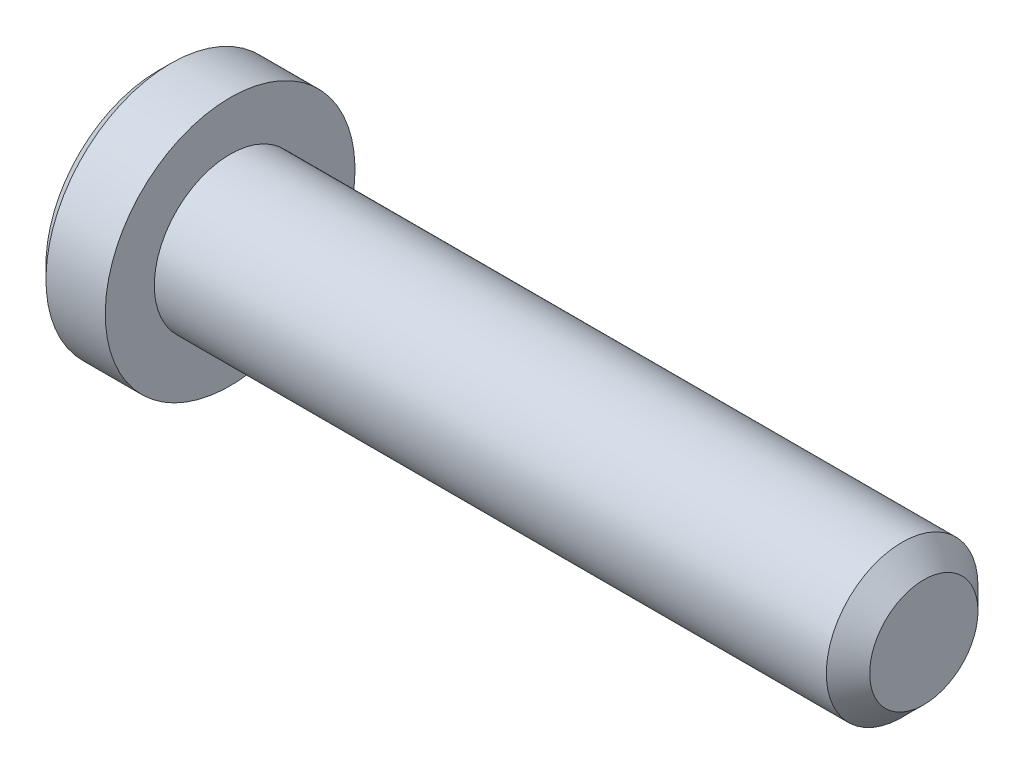
ISO-10303-21;
HEADER;
FILE_DESCRIPTION(('STEP AP214'),'2;1');
FILE_NAME('part.step','',(''),(''),'','','');
FILE_SCHEMA(('AUTOMOTIVE_DESIGN { 1 0 10303 214 1 1 1 1 }'));
ENDSEC;
DATA;
#1=APPLICATION_CONTEXT('core data for automotive mechanical design processes');
#2=APPLICATION_PROTOCOL_DEFINITION('international standard','automotive_design',2000,#1);
#3=PRODUCT_CONTEXT('',#1,'mechanical');
#4=PRODUCT('Part','Part','',(#3));
#5=PRODUCT_RELATED_PRODUCT_CATEGORY('part','',(#4));
#6=PRODUCT_DEFINITION_FORMATION('','',#4);
#7=PRODUCT_DEFINITION_CONTEXT('part definition',#1,'design');
#8=PRODUCT_DEFINITION('design','',#6,#7);
#9=PRODUCT_DEFINITION_SHAPE('','',#8);
#10=(LENGTH_UNIT() NAMED_UNIT(*) SI_UNIT(.MILLI.,.METRE.));
#11=(NAMED_UNIT(*) PLANE_ANGLE_UNIT() SI_UNIT($,.RADIAN.));
#12=(NAMED_UNIT(*) SI_UNIT($,.STERADIAN.) SOLID_ANGLE_UNIT());
#13=UNCERTAINTY_MEASURE_WITH_UNIT(LENGTH_MEASURE(1.E-05),#10,'distance_accuracy_value','');
#14=(GEOMETRIC_REPRESENTATION_CONTEXT(3) GLOBAL_UNCERTAINTY_ASSIGNED_CONTEXT((#13)) GLOBAL_UNIT_ASSIGNED_CONTEXT((#10,
#11,#12)) REPRESENTATION_CONTEXT('',''));
#15=CARTESIAN_POINT('',(0.,0.,0.));
#16=DIRECTION('',(0.,0.,1.));
#17=DIRECTION('',(1.,0.,0.));
#18=AXIS2_PLACEMENT_3D('',#15,#16,#17);
#19=CARTESIAN_POINT('',(-11.509375,3.0734,0.));
#20=DIRECTION('',(-1.,0.,0.));
#21=DIRECTION('',(0.,-1.,0.));
#22=AXIS2_PLACEMENT_3D('',#19,#20,#21);
#23=PLANE('',#22);
#24=CARTESIAN_POINT('',(-11.509375,0.,0.));
#25=DIRECTION('',(-1.,0.,0.));
#26=DIRECTION('',(0.,-1.,0.));
#27=AXIS2_PLACEMENT_3D('',#24,#25,#26);
#28=CIRCLE('',#27,1.14567944042314);
#29=CARTESIAN_POINT('',(-11.509375,-1.14567944042313,0.));
#30=VERTEX_POINT('',#29);
#31=CARTESIAN_POINT('',(-11.509375,-0.572839720211614,0.992187499999946));
#32=VERTEX_POINT('',#31);
#33=EDGE_CURVE('E142',#30,#32,#28,.T.);
#34=ORIENTED_EDGE('',*,*,#33,.F.);
#35=CARTESIAN_POINT('',(-11.509375,-0.572839720211583,-0.9921875));
#36=VERTEX_POINT('',#35);
#37=EDGE_CURVE('E139',#36,#30,#28,.T.);
#38=ORIENTED_EDGE('',*,*,#37,.F.);
#39=CARTESIAN_POINT('',(-11.509375,0.572839720211541,-0.992187499999999));
#40=VERTEX_POINT('',#39);
#41=EDGE_CURVE('E107',#40,#36,#28,.T.);
#42=ORIENTED_EDGE('',*,*,#41,.F.);
#43=CARTESIAN_POINT('',(-11.509375,1.14567944042315,0.));
#44=VERTEX_POINT('',#43);
#45=EDGE_CURVE('E99',#44,#40,#28,.T.);
#46=ORIENTED_EDGE('',*,*,#45,.F.);
#47=CARTESIAN_POINT('',(-11.509375,0.572839720211539,0.9921875));
#48=VERTEX_POINT('',#47);
#49=EDGE_CURVE('E60',#48,#44,#28,.T.);
#50=ORIENTED_EDGE('',*,*,#49,.F.);
#51=EDGE_CURVE('E67',#32,#48,#28,.T.);
#52=ORIENTED_EDGE('',*,*,#51,.F.);
#53=EDGE_LOOP('',(#34,#38,#42,#46,#50,#52));
#54=FACE_BOUND('',#53,.T.);
#55=CARTESIAN_POINT('',(-11.509375,0.,0.));
#56=DIRECTION('',(1.,0.,0.));
#57=DIRECTION('',(0.,1.,0.));
#58=AXIS2_PLACEMENT_3D('',#55,#56,#57);
#59=CIRCLE('',#58,3.0734);
#60=CARTESIAN_POINT('',(-11.509375,3.0734,0.));
#61=VERTEX_POINT('',#60);
#62=EDGE_CURVE('E237',#61,#61,#59,.T.);
#63=ORIENTED_EDGE('',*,*,#62,.F.);
#64=EDGE_LOOP('',(#63));
#65=FACE_BOUND('',#64,.T.);
#66=ADVANCED_FACE('F39',(#54,#65),#23,.T.);
#67=CARTESIAN_POINT('',(-9.525,0.,0.));
#68=DIRECTION('',(1.,0.,0.));
#69=DIRECTION('',(0.,0.,-1.));
#70=AXIS2_PLACEMENT_3D('',#67,#68,#69);
#71=CYLINDRICAL_SURFACE('',#70,2.0828);
#72=CARTESIAN_POINT('',(8.9296875,0.,0.));
#73=DIRECTION('',(1.,0.,0.));
#74=DIRECTION('',(0.,0.,-1.));
#75=AXIS2_PLACEMENT_3D('',#72,#73,#74);
#76=CIRCLE('',#75,2.0828);
#77=CARTESIAN_POINT('',(8.9296875,0.,-2.0828));
#78=VERTEX_POINT('',#77);
#79=EDGE_CURVE('E54',#78,#78,#76,.F.);
#80=CARTESIAN_POINT('',(-9.525,0.,0.));
#81=DIRECTION('',(1.,0.,0.));
#82=DIRECTION('',(0.,1.,0.));
#83=AXIS2_PLACEMENT_3D('',#80,#81,#82);
#84=CIRCLE('',#83,2.0828);
#85=CARTESIAN_POINT('',(-9.525,0.,-2.0828));
#86=VERTEX_POINT('',#85);
#87=EDGE_CURVE('E227',#86,#86,#84,.F.);
#88=CARTESIAN_POINT('',(8.9296875,0.,-2.0828));
#89=CARTESIAN_POINT('',(8.737451171875,0.,-2.0828));
#90=CARTESIAN_POINT('',(8.54521484375,0.,-2.0828));
#91=CARTESIAN_POINT('',(8.1607421875,0.,-2.0828));
#92=CARTESIAN_POINT('',(7.968505859375,0.,-2.0828));
#93=CARTESIAN_POINT('',(7.584033203125,0.,-2.0828));
#94=CARTESIAN_POINT('',(7.391796875,0.,-2.0828));
#95=CARTESIAN_POINT('',(7.00732421875,0.,-2.0828));
#96=CARTESIAN_POINT('',(6.815087890625,0.,-2.0828));
#97=CARTESIAN_POINT('',(6.430615234375,0.,-2.0828));
#98=CARTESIAN_POINT('',(6.23837890625,0.,-2.0828));
#99=CARTESIAN_POINT('',(5.85390625,0.,-2.0828));
#100=CARTESIAN_POINT('',(5.661669921875,0.,-2.0828));
#101=CARTESIAN_POINT('',(5.277197265625,0.,-2.0828));
#102=CARTESIAN_POINT('',(5.0849609375,0.,-2.0828));
#103=CARTESIAN_POINT('',(4.70048828125,0.,-2.0828));
#104=CARTESIAN_POINT('',(4.508251953125,0.,-2.0828));
#105=CARTESIAN_POINT('',(4.123779296875,0.,-2.0828));
#106=CARTESIAN_POINT('',(3.93154296875,0.,-2.0828));
#107=CARTESIAN_POINT('',(3.5470703125,0.,-2.0828));
#108=CARTESIAN_POINT('',(3.354833984375,0.,-2.0828));
#109=CARTESIAN_POINT('',(2.970361328125,0.,-2.0828));
#110=CARTESIAN_POINT('',(2.778125,0.,-2.0828));
#111=CARTESIAN_POINT('',(2.39365234375,0.,-2.0828));
#112=CARTESIAN_POINT('',(2.201416015625,0.,-2.0828));
#113=CARTESIAN_POINT('',(1.816943359375,0.,-2.0828));
#114=CARTESIAN_POINT('',(1.62470703125,0.,-2.0828));
#115=CARTESIAN_POINT('',(1.240234375,0.,-2.0828));
#116=CARTESIAN_POINT('',(1.047998046875,0.,-2.0828));
#117=CARTESIAN_POINT('',(0.663525390625,0.,-2.0828));
#118=CARTESIAN_POINT('',(0.4712890625,0.,-2.0828));
#119=CARTESIAN_POINT('',(0.0868164062500001,0.,-2.0828));
#120=CARTESIAN_POINT('',(-0.105419921875,0.,-2.0828));
#121=CARTESIAN_POINT('',(-0.489892578125,0.,-2.0828));
#122=CARTESIAN_POINT('',(-0.68212890625,0.,-2.0828));
#123=CARTESIAN_POINT('',(-1.0666015625,0.,-2.0828));
#124=CARTESIAN_POINT('',(-1.258837890625,0.,-2.0828));
#125=CARTESIAN_POINT('',(-1.643310546875,0.,-2.0828));
#126=CARTESIAN_POINT('',(-1.835546875,0.,-2.0828));
#127=CARTESIAN_POINT('',(-2.22001953125,0.,-2.0828));
#128=CARTESIAN_POINT('',(-2.412255859375,0.,-2.0828));
#129=CARTESIAN_POINT('',(-2.796728515625,0.,-2.0828));
#130=CARTESIAN_POINT('',(-2.98896484375,0.,-2.0828));
#131=CARTESIAN_POINT('',(-3.3734375,0.,-2.0828));
#132=CARTESIAN_POINT('',(-3.565673828125,0.,-2.0828));
#133=CARTESIAN_POINT('',(-3.950146484375,0.,-2.0828));
#134=CARTESIAN_POINT('',(-4.1423828125,0.,-2.0828));
#135=CARTESIAN_POINT('',(-4.52685546875,0.,-2.0828));
#136=CARTESIAN_POINT('',(-4.719091796875,0.,-2.0828));
#137=CARTESIAN_POINT('',(-5.103564453125,0.,-2.0828));
#138=CARTESIAN_POINT('',(-5.29580078125,0.,-2.0828));
#139=CARTESIAN_POINT('',(-5.6802734375,0.,-2.0828));
#140=CARTESIAN_POINT('',(-5.872509765625,0.,-2.0828));
#141=CARTESIAN_POINT('',(-6.256982421875,0.,-2.0828));
#142=CARTESIAN_POINT('',(-6.44921875,0.,-2.0828));
#143=CARTESIAN_POINT('',(-6.83369140625,0.,-2.0828));
#144=CARTESIAN_POINT('',(-7.025927734375,0.,-2.0828));
#145=CARTESIAN_POINT('',(-7.410400390625,0.,-2.0828));
#146=CARTESIAN_POINT('',(-7.60263671875,0.,-2.0828));
#147=CARTESIAN_POINT('',(-7.987109375,0.,-2.0828));
#148=CARTESIAN_POINT('',(-8.179345703125,0.,-2.0828));
#149=CARTESIAN_POINT('',(-8.563818359375,0.,-2.0828));
#150=CARTESIAN_POINT('',(-8.7560546875,0.,-2.0828));
#151=CARTESIAN_POINT('',(-9.14052734375,0.,-2.0828));
#152=CARTESIAN_POINT('',(-9.332763671875,0.,-2.0828));
#153=CARTESIAN_POINT('',(-9.525,0.,-2.0828));
#154=B_SPLINE_CURVE_WITH_KNOTS('',3,(#88,#89,#90,#91,#92,#93,#94,#95,#96,#97,#98,#99,#100,#101,
#102,#103,#104,#105,#106,#107,#108,#109,#110,#111,#112,#113,#114,#115,#116,#117,#118,#119,#120,
#121,#122,#123,#124,#125,#126,#127,#128,#129,#130,#131,#132,#133,#134,#135,#136,#137,#138,#139,
#140,#141,#142,#143,#144,#145,#146,#147,#148,#149,#150,#151,#152,#153),.UNSPECIFIED.,.F.,.F.,(4,
2,2,2,2,2,2,2,2,2,2,2,2,2,2,2,2,2,2,2,2,2,2,2,2,2,2,2,2,2,2,2,4),(0.,0.576708984375,
1.15341796875,1.730126953125,2.3068359375,2.883544921875,3.46025390625,4.036962890625,
4.613671875,5.190380859375,5.76708984375,6.343798828125,6.9205078125,7.497216796875,
8.07392578125,8.650634765625,9.22734375,9.804052734375,10.38076171875,10.957470703125,
11.5341796875,12.110888671875,12.68759765625,13.264306640625,13.841015625,14.417724609375,
14.99443359375,15.571142578125,16.1478515625,16.724560546875,17.30126953125,17.877978515625,
18.4546875),.UNSPECIFIED.);
#155=EDGE_CURVE('BSEAM207',#78,#86,#154,.T.);
#156=ORIENTED_EDGE('',*,*,#79,.T.);
#157=ORIENTED_EDGE('',*,*,#87,.F.);
#158=ORIENTED_EDGE('',*,*,#155,.T.);
#159=ORIENTED_EDGE('',*,*,#155,.F.);
#160=EDGE_LOOP('',(#156,#158,#157,#159));
#161=FACE_BOUND('',#160,.T.);
#162=ADVANCED_FACE('F207',(#161),#71,.T.);
#163=CARTESIAN_POINT('',(9.525,0.,0.));
#164=DIRECTION('',(1.,0.,0.));
#165=DIRECTION('',(0.,0.,-1.));
#166=AXIS2_PLACEMENT_3D('',#163,#164,#165);
#167=PLANE('',#166);
#168=CARTESIAN_POINT('',(9.525,0.,0.));
#169=DIRECTION('',(1.,0.,0.));
#170=DIRECTION('',(0.,0.,-1.));
#171=AXIS2_PLACEMENT_3D('',#168,#169,#170);
#172=CIRCLE('',#171,1.48748749999999);
#173=CARTESIAN_POINT('',(9.525,0.,-1.48748749999999));
#174=VERTEX_POINT('',#173);
#175=EDGE_CURVE('E229',#174,#174,#172,.T.);
#176=ORIENTED_EDGE('',*,*,#175,.T.);
#177=EDGE_LOOP('',(#176));
#178=FACE_BOUND('',#177,.T.);
#179=ADVANCED_FACE('F215',(#178),#167,.T.);
#180=CARTESIAN_POINT('',(9.525,0.,0.));
#181=DIRECTION('',(-1.,0.,0.));
#182=DIRECTION('',(0.,0.,1.));
#183=AXIS2_PLACEMENT_3D('',#180,#181,#182);
#184=CONICAL_SURFACE('',#183,1.48748749999999,0.785398163397454);
#185=ORIENTED_EDGE('',*,*,#79,.F.);
#186=EDGE_LOOP('',(#185));
#187=FACE_BOUND('',#186,.T.);
#188=ORIENTED_EDGE('',*,*,#175,.F.);
#189=EDGE_LOOP('',(#188));
#190=FACE_BOUND('',#189,.T.);
#191=ADVANCED_FACE('F41',(#187,#190),#184,.T.);
#192=CARTESIAN_POINT('',(-9.525,0.,0.));
#193=DIRECTION('',(1.,0.,0.));
#194=DIRECTION('',(0.,1.,0.));
#195=AXIS2_PLACEMENT_3D('',#192,#193,#194);
#196=CYLINDRICAL_SURFACE('',#195,3.429);
#197=CARTESIAN_POINT('',(-11.153775,0.,0.));
#198=DIRECTION('',(1.,0.,0.));
#199=DIRECTION('',(0.,1.,0.));
#200=AXIS2_PLACEMENT_3D('',#197,#198,#199);
#201=CIRCLE('',#200,3.429);
#202=CARTESIAN_POINT('',(-11.153775,3.429,0.));
#203=VERTEX_POINT('',#202);
#204=EDGE_CURVE('E230',#203,#203,#201,.T.);
#205=ORIENTED_EDGE('',*,*,#204,.T.);
#206=EDGE_LOOP('',(#205));
#207=FACE_BOUND('',#206,.T.);
#208=CARTESIAN_POINT('',(-9.525,0.,0.));
#209=DIRECTION('',(1.,0.,0.));
#210=DIRECTION('',(0.,1.,0.));
#211=AXIS2_PLACEMENT_3D('',#208,#209,#210);
#212=CIRCLE('',#211,3.429);
#213=CARTESIAN_POINT('',(-9.525,3.429,0.));
#214=VERTEX_POINT('',#213);
#215=EDGE_CURVE('E244',#214,#214,#212,.T.);
#216=ORIENTED_EDGE('',*,*,#215,.F.);
#217=EDGE_LOOP('',(#216));
#218=FACE_BOUND('',#217,.T.);
#219=ADVANCED_FACE('F210',(#207,#218),#196,.T.);
#220=CARTESIAN_POINT('',(-11.153775,0.,0.));
#221=DIRECTION('',(1.,0.,0.));
#222=DIRECTION('',(0.,1.,0.));
#223=AXIS2_PLACEMENT_3D('',#220,#221,#222);
#224=CONICAL_SURFACE('',#223,3.429,0.785398163397454);
#225=ORIENTED_EDGE('',*,*,#62,.T.);
#226=EDGE_LOOP('',(#225));
#227=FACE_BOUND('',#226,.T.);
#228=ORIENTED_EDGE('',*,*,#204,.F.);
#229=EDGE_LOOP('',(#228));
#230=FACE_BOUND('',#229,.T.);
#231=ADVANCED_FACE('F203',(#227,#230),#224,.T.);
#232=CARTESIAN_POINT('',(-9.525,3.429,0.));
#233=DIRECTION('',(1.,0.,0.));
#234=DIRECTION('',(0.,1.,0.));
#235=AXIS2_PLACEMENT_3D('',#232,#233,#234);
#236=PLANE('',#235);
#237=ORIENTED_EDGE('',*,*,#87,.T.);
#238=EDGE_LOOP('',(#237));
#239=FACE_BOUND('',#238,.T.);
#240=ORIENTED_EDGE('',*,*,#215,.T.);
#241=EDGE_LOOP('',(#240));
#242=FACE_BOUND('',#241,.T.);
#243=ADVANCED_FACE('F166',(#239,#242),#236,.T.);
#244=CARTESIAN_POINT('',(-11.509375,0.,0.));
#245=DIRECTION('',(-1.,0.,0.));
#246=DIRECTION('',(0.,-1.,0.));
#247=AXIS2_PLACEMENT_3D('',#244,#245,#246);
#248=CONICAL_SURFACE('',#247,1.14567944042314,0.78539816339745);
#249=CARTESIAN_POINT('',(-11.8768670395338,-1.14247621095532,-0.9921875));
#250=CARTESIAN_POINT('',(-11.8558666393704,-1.11465764817296,-0.9921875));
#251=CARTESIAN_POINT('',(-11.8350721478217,-1.08668408109738,-0.9921875));
#252=CARTESIAN_POINT('',(-11.7939800377932,-1.03036405380651,-0.9921875));
#253=CARTESIAN_POINT('',(-11.7736825444585,-1.00201750238007,-0.9921875));
#254=CARTESIAN_POINT('',(-11.7133735075809,-0.915909012474774,-0.9921875));
#255=CARTESIAN_POINT('',(-11.67426885225,-0.857501195957509,-0.9921875));
#256=CARTESIAN_POINT('',(-11.5975017528187,-0.735022281337396,-0.9921875));
#257=CARTESIAN_POINT('',(-11.5600490310437,-0.670818221979862,-0.9921875));
#258=CARTESIAN_POINT('',(-11.4915400204898,-0.539203244273786,-0.9921875));
#259=CARTESIAN_POINT('',(-11.4604621682744,-0.471804119013388,-0.9921875));
#260=CARTESIAN_POINT('',(-11.42244129625,-0.370637445291602,-0.9921875));
#261=CARTESIAN_POINT('',(-11.4115290323464,-0.338367677294395,-0.9921875));
#262=CARTESIAN_POINT('',(-11.392295230113,-0.273049086298095,-0.9921875));
#263=CARTESIAN_POINT('',(-11.3839738702603,-0.240000209797903,-0.992187499999999));
#264=CARTESIAN_POINT('',(-11.3704937736932,-0.173878395879211,-0.992187499999999));
#265=CARTESIAN_POINT('',(-11.3652803939747,-0.140816774783566,-0.992187499999999));
#266=CARTESIAN_POINT('',(-11.3581147124628,-0.0743291672741376,-0.992187499999999));
#267=CARTESIAN_POINT('',(-11.3561629080388,-0.0409031260707294,-0.992187499999999));
#268=CARTESIAN_POINT('',(-11.3556684859037,0.0247631140270538,-0.992187499999999));
#269=CARTESIAN_POINT('',(-11.3570050314158,0.0570024444112343,-0.992187499999999));
#270=CARTESIAN_POINT('',(-11.3627460432024,0.121194220405742,-0.992187499999999));
#271=CARTESIAN_POINT('',(-11.367149804079,0.153146730268,-0.992187499999999));
#272=CARTESIAN_POINT('',(-11.3788595111375,0.21709052455368,-0.992187499999999));
#273=CARTESIAN_POINT('',(-11.3862153024107,0.249072542042758,-0.992187499999999));
#274=CARTESIAN_POINT('',(-11.4034380913517,0.312337779646064,-0.992187499999999));
#275=CARTESIAN_POINT('',(-11.4133048788974,0.343621057993199,-0.992187499999999));
#276=CARTESIAN_POINT('',(-11.4480811115409,0.442112982998633,-0.992187499999999));
#277=CARTESIAN_POINT('',(-11.476951164078,0.507919771037756,-0.992187499999999));
#278=CARTESIAN_POINT('',(-11.5411402098148,0.636441890981761,-0.992187499999999));
#279=CARTESIAN_POINT('',(-11.5764823720824,0.699145053739854,-0.992187499999999));
#280=CARTESIAN_POINT('',(-11.6493963707045,0.818979829838894,-0.992187499999999));
#281=CARTESIAN_POINT('',(-11.6867701348683,0.87623347144014,-0.992187499999999));
#282=CARTESIAN_POINT('',(-11.744546111699,0.960585190489413,-0.992187499999999));
#283=CARTESIAN_POINT('',(-11.764008487457,0.988338378120962,-0.992187499999999));
#284=CARTESIAN_POINT('',(-11.803447981541,1.04346551309541,-0.992187499999999));
#285=CARTESIAN_POINT('',(-11.8234249576456,1.07083956207301,-0.992187499999999));
#286=CARTESIAN_POINT('',(-11.8436153053952,1.09805574489948,-0.992187499999999));
#287=B_SPLINE_CURVE_WITH_KNOTS('',3,(#249,#250,#251,#252,#253,#254,#255,#256,#257,#258,#259,
#260,#261,#262,#263,#264,#265,#266,#267,#268,#269,#270,#271,#272,#273,#274,#275,#276,#277,#278,
#279,#280,#281,#282,#283,#284,#285,#286),.UNSPECIFIED.,.F.,.F.,(4,2,2,2,2,2,2,2,2,2,2,2,2,2,2,2,
2,2,4),(0.,0.104563127391605,0.20915231871892,0.419927099055484,0.642732653996011,
0.864771652302185,0.966879847198756,1.06899507437088,1.1692575299655,1.2695352735478,
1.36618351698525,1.4628095406014,1.56114078104352,1.65946379575192,1.87441437169281,
2.090150036015,2.29516517561956,2.39685303361285,2.4985130831926),.UNSPECIFIED.);
#288=EDGE_CURVE('E11',#36,#40,#287,.T.);
#289=ORIENTED_EDGE('',*,*,#288,.T.);
#290=ORIENTED_EDGE('',*,*,#41,.T.);
#291=EDGE_LOOP('',(#289,#290));
#292=FACE_BOUND('',#291,.T.);
#293=ADVANCED_FACE('F112',(#292),#248,.F.);
#294=CARTESIAN_POINT('',(-11.509490487509,-1.145794910477,0.000199999999999935));
#295=CARTESIAN_POINT('',(-11.4898078114047,-1.12609913995856,-0.0339140752321566));
#296=CARTESIAN_POINT('',(-11.4712806845185,-1.10607402631377,-0.0685985894922806));
#297=CARTESIAN_POINT('',(-11.4373573296504,-1.06524035596263,-0.139324581199961));
#298=CARTESIAN_POINT('',(-11.421979987231,-1.04442791197037,-0.175372791624244));
#299=CARTESIAN_POINT('',(-11.3956381427343,-1.00246048249572,-0.248062511737398));
#300=CARTESIAN_POINT('',(-11.3846073965132,-0.98131619670701,-0.284685489013204));
#301=CARTESIAN_POINT('',(-11.367611205673,-0.938562244623586,-0.35873750624606));
#302=CARTESIAN_POINT('',(-11.361633067579,-0.916953885244211,-0.396164282559346));
#303=CARTESIAN_POINT('',(-11.3562413449143,-0.879714587318151,-0.460664638605475));
#304=CARTESIAN_POINT('',(-11.3554439963884,-0.86413209944244,-0.487654299314533));
#305=CARTESIAN_POINT('',(-11.3567831933615,-0.83299729877985,-0.541581355945668));
#306=CARTESIAN_POINT('',(-11.3589203861371,-0.81744499340817,-0.568518739024244));
#307=CARTESIAN_POINT('',(-11.3695925713061,-0.771010163908482,-0.648946222958502));
#308=CARTESIAN_POINT('',(-11.3823893807227,-0.740358726795443,-0.702036069363288));
#309=CARTESIAN_POINT('',(-11.4132724676502,-0.686562055130078,-0.795214637965801));
#310=CARTESIAN_POINT('',(-11.4297400089077,-0.663164549602743,-0.835740306309519));
#311=CARTESIAN_POINT('',(-11.4668353835568,-0.617285982385523,-0.915204315708208));
#312=CARTESIAN_POINT('',(-11.4874496806456,-0.594802217831309,-0.954147338261523));
#313=CARTESIAN_POINT('',(-11.509490487509,-0.572724250157745,-0.992387499999999));
#314=B_SPLINE_CURVE_WITH_KNOTS('',3,(#294,#295,#296,#297,#298,#299,#300,#301,#302,#303,#304,
#305,#306,#307,#308,#309,#310,#311,#312,#313),.UNSPECIFIED.,.F.,.F.,(4,2,2,2,2,2,2,2,2,4),(0.,
0.132197185210191,0.265165186853265,0.396020097605673,0.526545281028579,0.619935205043269,
0.71334573153617,0.900220051846375,1.04884529769095,1.19699303557669),.UNSPECIFIED.);
#315=EDGE_CURVE('E145',#30,#36,#314,.T.);
#316=ORIENTED_EDGE('',*,*,#315,.T.);
#317=ORIENTED_EDGE('',*,*,#37,.T.);
#318=EDGE_LOOP('',(#316,#317));
#319=FACE_BOUND('',#318,.T.);
#320=ADVANCED_FACE('F165',(#319),#248,.F.);
#321=CARTESIAN_POINT('',(-11.509490487509,-0.572724250157744,0.9923875));
#322=CARTESIAN_POINT('',(-11.4898078114047,-0.592420020676184,0.958273424767845));
#323=CARTESIAN_POINT('',(-11.4712806845184,-0.612445134320978,0.923588910507721));
#324=CARTESIAN_POINT('',(-11.4373573296504,-0.65327880467211,0.852862918800042));
#325=CARTESIAN_POINT('',(-11.421979987231,-0.674091248664374,0.816814708375759));
#326=CARTESIAN_POINT('',(-11.3956381427343,-0.716058678139021,0.744124988262607));
#327=CARTESIAN_POINT('',(-11.3846073965132,-0.737202963927733,0.707502010986801));
#328=CARTESIAN_POINT('',(-11.367611205673,-0.779956916011156,0.633449993753947));
#329=CARTESIAN_POINT('',(-11.361633067579,-0.801565275390531,0.596023217440661));
#330=CARTESIAN_POINT('',(-11.3562413449143,-0.83880457331659,0.531522861394533));
#331=CARTESIAN_POINT('',(-11.3554439963884,-0.854387061192302,0.504533200685474));
#332=CARTESIAN_POINT('',(-11.3567831933615,-0.885521861854892,0.450606144054339));
#333=CARTESIAN_POINT('',(-11.3589203861371,-0.901074167226571,0.423668760975764));
#334=CARTESIAN_POINT('',(-11.3695925713061,-0.94750899672626,0.343241277041506));
#335=CARTESIAN_POINT('',(-11.3823893807228,-0.978160433839299,0.29015143063672));
#336=CARTESIAN_POINT('',(-11.4132724676502,-1.03195710550467,0.196972862034205));
#337=CARTESIAN_POINT('',(-11.4297400089077,-1.055354611032,0.156447193690485));
#338=CARTESIAN_POINT('',(-11.4668353835568,-1.10123317824922,0.0769831842917937));
#339=CARTESIAN_POINT('',(-11.4874496806456,-1.12371694280344,0.0380401617384772));
#340=CARTESIAN_POINT('',(-11.509490487509,-1.145794910477,-0.000199999999999281));
#341=B_SPLINE_CURVE_WITH_KNOTS('',3,(#321,#322,#323,#324,#325,#326,#327,#328,#329,#330,#331,
#332,#333,#334,#335,#336,#337,#338,#339,#340),.UNSPECIFIED.,.F.,.F.,(4,2,2,2,2,2,2,2,2,4),(0.,
0.13219718521019,0.26516518685326,0.396020097605666,0.526545281028569,0.61993520504326,
0.71334573153616,0.900220051846366,1.04884529769095,1.19699303557669),.UNSPECIFIED.);
#342=EDGE_CURVE('E153',#32,#30,#341,.T.);
#343=ORIENTED_EDGE('',*,*,#342,.T.);
#344=ORIENTED_EDGE('',*,*,#33,.T.);
#345=EDGE_LOOP('',(#343,#344));
#346=FACE_BOUND('',#345,.T.);
#347=ADVANCED_FACE('F291',(#346),#248,.F.);
#348=CARTESIAN_POINT('',(-11.8768670394083,-1.1424762107891,0.9921875));
#349=CARTESIAN_POINT('',(-11.8558666392497,-1.1146576480114,0.9921875));
#350=CARTESIAN_POINT('',(-11.8350721477058,-1.0866840809405,0.9921875));
#351=CARTESIAN_POINT('',(-11.7939800376869,-1.03036405365903,0.9921875));
#352=CARTESIAN_POINT('',(-11.7736825443571,-1.00201750223731,0.9921875));
#353=CARTESIAN_POINT('',(-11.713373507494,-0.915909012346482,0.9921875));
#354=CARTESIAN_POINT('',(-11.6742688521727,-0.857501195839053,0.9921875));
#355=CARTESIAN_POINT('',(-11.5975017527612,-0.735022281240391,0.9921875));
#356=CARTESIAN_POINT('',(-11.5600490309963,-0.67081822189453,0.9921875));
#357=CARTESIAN_POINT('',(-11.4915400204611,-0.53920324421279,0.9921875));
#358=CARTESIAN_POINT('',(-11.4604621682543,-0.47180411896505,0.9921875));
#359=CARTESIAN_POINT('',(-11.4224412962363,-0.370637445252787,0.9921875));
#360=CARTESIAN_POINT('',(-11.4115290323325,-0.338367677251593,0.9921875));
#361=CARTESIAN_POINT('',(-11.3922952300994,-0.273049086247186,0.9921875));
#362=CARTESIAN_POINT('',(-11.3839738702472,-0.240000209742876,0.9921875));
#363=CARTESIAN_POINT('',(-11.3704937736822,-0.173878395816084,0.9921875));
#364=CARTESIAN_POINT('',(-11.3652803939651,-0.14081677471646,0.9921875));
#365=CARTESIAN_POINT('',(-11.3581147124571,-0.074329167199204,0.9921875));
#366=CARTESIAN_POINT('',(-11.3561629080355,-0.0409031259919471,0.9921875));
#367=CARTESIAN_POINT('',(-11.3556684859057,0.0247631141129358,0.9921875));
#368=CARTESIAN_POINT('',(-11.3570050314208,0.0570024445003773,0.9921875));
#369=CARTESIAN_POINT('',(-11.3627460432139,0.121194220501081,0.9921875));
#370=CARTESIAN_POINT('',(-11.3671498040939,0.153146730366273,0.9921875));
#371=CARTESIAN_POINT('',(-11.3788595111597,0.217090524657746,0.9921875));
#372=CARTESIAN_POINT('',(-11.3862153024367,0.249072542149675,0.9921875));
#373=CARTESIAN_POINT('',(-11.4034380913854,0.312337779758406,0.9921875));
#374=CARTESIAN_POINT('',(-11.413304878935,0.343621058108116,0.9921875));
#375=CARTESIAN_POINT('',(-11.4480811115969,0.442112983138572,0.9921875));
#376=CARTESIAN_POINT('',(-11.4769511641508,0.507919771198889,0.9921875));
#377=CARTESIAN_POINT('',(-11.5411402099234,0.636441891183654,0.9921875));
#378=CARTESIAN_POINT('',(-11.5764823722097,0.699145053961304,0.9921875));
#379=CARTESIAN_POINT('',(-11.6493963708677,0.818979830095504,0.9921875));
#380=CARTESIAN_POINT('',(-11.6867701350485,0.876233471712478,0.9921875));
#381=CARTESIAN_POINT('',(-11.7445461119046,0.960585190785008,0.9921875));
#382=CARTESIAN_POINT('',(-11.764008487671,0.988338378424199,0.9921875));
#383=CARTESIAN_POINT('',(-11.8034479817718,1.04346551341388,0.9921875));
#384=CARTESIAN_POINT('',(-11.8234249578848,1.07083956239907,0.9921875));
#385=CARTESIAN_POINT('',(-11.8436153056427,1.09805574523312,0.9921875));
#386=B_SPLINE_CURVE_WITH_KNOTS('',3,(#348,#349,#350,#351,#352,#353,#354,#355,#356,#357,#358,
#359,#360,#361,#362,#363,#364,#365,#366,#367,#368,#369,#370,#371,#372,#373,#374,#375,#376,#377,
#378,#379,#380,#381,#382,#383,#384,#385),.UNSPECIFIED.,.F.,.F.,(4,2,2,2,2,2,2,2,2,2,2,2,2,2,2,2,
2,2,4),(0.,0.104563127371704,0.209152318679109,0.419927098975113,0.642732653870155,
0.864771652131274,0.966879847039375,1.06899507422301,1.16925752982867,1.26953527342201,
1.36618351686957,1.46280954049584,1.56114078094884,1.65946379566813,1.87441437168726,
2.09015003608822,2.29516517576016,2.39685303378669,2.49851308339967),.UNSPECIFIED.);
#387=EDGE_CURVE('E173',#48,#32,#386,.F.);
#388=ORIENTED_EDGE('',*,*,#387,.T.);
#389=ORIENTED_EDGE('',*,*,#51,.T.);
#390=EDGE_LOOP('',(#388,#389));
#391=FACE_BOUND('',#390,.T.);
#392=ADVANCED_FACE('F309',(#391),#248,.F.);
#393=CARTESIAN_POINT('',(-11.509490487509,1.145794910477,-0.000200000000000433));
#394=CARTESIAN_POINT('',(-11.4898078114047,1.12609913995856,0.0339140752321554));
#395=CARTESIAN_POINT('',(-11.4712806845184,1.10607402631377,0.0685985894922788));
#396=CARTESIAN_POINT('',(-11.4373573296504,1.06524035596264,0.139324581199958));
#397=CARTESIAN_POINT('',(-11.421979987231,1.04442791197037,0.175372791624241));
#398=CARTESIAN_POINT('',(-11.3956381427343,1.00246048249573,0.248062511737394));
#399=CARTESIAN_POINT('',(-11.3846073965132,0.981316196707013,0.284685489013199));
#400=CARTESIAN_POINT('',(-11.367611205673,0.93856224462359,0.358737506246054));
#401=CARTESIAN_POINT('',(-11.3616330675789,0.916953885244215,0.39616428255934));
#402=CARTESIAN_POINT('',(-11.3562413449143,0.879714587318156,0.460664638605467));
#403=CARTESIAN_POINT('',(-11.3554439963884,0.864132099442445,0.487654299314526));
#404=CARTESIAN_POINT('',(-11.3567831933614,0.832997298779855,0.54158135594566));
#405=CARTESIAN_POINT('',(-11.3589203861371,0.817444993408175,0.568518739024236));
#406=CARTESIAN_POINT('',(-11.369592571306,0.771010163908488,0.648946222958493));
#407=CARTESIAN_POINT('',(-11.3823893807227,0.740358726795449,0.702036069363278));
#408=CARTESIAN_POINT('',(-11.4132724676501,0.686562055130083,0.795214637965794));
#409=CARTESIAN_POINT('',(-11.4297400089077,0.663164549602747,0.835740306309513));
#410=CARTESIAN_POINT('',(-11.4668353835568,0.617285982385525,0.915204315708206));
#411=CARTESIAN_POINT('',(-11.4874496806456,0.59480221783131,0.954147338261523));
#412=CARTESIAN_POINT('',(-11.509490487509,0.572724250157745,0.9923875));
#413=B_SPLINE_CURVE_WITH_KNOTS('',3,(#393,#394,#395,#396,#397,#398,#399,#400,#401,#402,#403,
#404,#405,#406,#407,#408,#409,#410,#411,#412),.UNSPECIFIED.,.F.,.F.,(4,2,2,2,2,2,2,2,2,4),(0.,
0.132197185210189,0.265165186853261,0.396020097605667,0.52654528102857,0.619935205043261,
0.71334573153616,0.900220051846364,1.04884529769095,1.1969930355767),.UNSPECIFIED.);
#414=EDGE_CURVE('E128',#44,#48,#413,.T.);
#415=ORIENTED_EDGE('',*,*,#414,.T.);
#416=ORIENTED_EDGE('',*,*,#49,.T.);
#417=EDGE_LOOP('',(#415,#416));
#418=FACE_BOUND('',#417,.T.);
#419=ADVANCED_FACE('F281',(#418),#248,.F.);
#420=CARTESIAN_POINT('',(-11.509490487509,0.572724250157746,-0.992387499999999));
#421=CARTESIAN_POINT('',(-11.4898078114047,0.592420020676186,-0.958273424767843));
#422=CARTESIAN_POINT('',(-11.4712806845184,0.61244513432098,-0.923588910507719));
#423=CARTESIAN_POINT('',(-11.4373573296504,0.653278804672112,-0.852862918800039));
#424=CARTESIAN_POINT('',(-11.421979987231,0.674091248664377,-0.816814708375756));
#425=CARTESIAN_POINT('',(-11.3956381427343,0.716058678139025,-0.744124988262602));
#426=CARTESIAN_POINT('',(-11.3846073965132,0.737202963927737,-0.707502010986796));
#427=CARTESIAN_POINT('',(-11.367611205673,0.779956916011161,-0.63344999375394));
#428=CARTESIAN_POINT('',(-11.3616330675789,0.801565275390537,-0.596023217440653));
#429=CARTESIAN_POINT('',(-11.3562413449143,0.838804573316595,-0.531522861394525));
#430=CARTESIAN_POINT('',(-11.3554439963884,0.854387061192307,-0.504533200685466));
#431=CARTESIAN_POINT('',(-11.3567831933614,0.885521861854897,-0.450606144054332));
#432=CARTESIAN_POINT('',(-11.3589203861371,0.901074167226576,-0.423668760975757));
#433=CARTESIAN_POINT('',(-11.369592571306,0.947508996726264,-0.343241277041499));
#434=CARTESIAN_POINT('',(-11.3823893807227,0.978160433839303,-0.290151430636714));
#435=CARTESIAN_POINT('',(-11.4132724676501,1.03195710550467,-0.1969728620342));
#436=CARTESIAN_POINT('',(-11.4297400089077,1.055354611032,-0.156447193690481));
#437=CARTESIAN_POINT('',(-11.4668353835568,1.10123317824922,-0.0769831842917914));
#438=CARTESIAN_POINT('',(-11.4874496806456,1.12371694280344,-0.0380401617384758));
#439=CARTESIAN_POINT('',(-11.509490487509,1.145794910477,0.000200000000000225));
#440=B_SPLINE_CURVE_WITH_KNOTS('',3,(#420,#421,#422,#423,#424,#425,#426,#427,#428,#429,#430,
#431,#432,#433,#434,#435,#436,#437,#438,#439),.UNSPECIFIED.,.F.,.F.,(4,2,2,2,2,2,2,2,2,4),(0.,
0.132197185210192,0.265165186853265,0.396020097605673,0.526545281028579,0.619935205043269,
0.713345731536169,0.900220051846373,1.04884529769095,1.1969930355767),.UNSPECIFIED.);
#441=EDGE_CURVE('E102',#40,#44,#440,.T.);
#442=ORIENTED_EDGE('',*,*,#441,.T.);
#443=ORIENTED_EDGE('',*,*,#45,.T.);
#444=EDGE_LOOP('',(#442,#443));
#445=FACE_BOUND('',#444,.T.);
#446=ADVANCED_FACE('F100',(#445),#248,.F.);
#447=CARTESIAN_POINT('',(-9.985375,1.14567944042316,0.));
#448=DIRECTION('',(1.,0.,0.));
#449=DIRECTION('',(0.,0.,-1.));
#450=AXIS2_PLACEMENT_3D('',#447,#448,#449);
#451=PLANE('',#450);
#452=DIRECTION('',(0.,0.5,0.866025403784439));
#453=VECTOR('',#452,1.);
#454=CARTESIAN_POINT('',(-9.985375,0.572839720211583,-0.992187499999999));
#455=LINE('',#454,#453);
#456=CARTESIAN_POINT('',(-9.985375,0.572839720211583,-0.992187499999999));
#457=VERTEX_POINT('',#456);
#458=CARTESIAN_POINT('',(-9.985375,1.14567944042316,0.));
#459=VERTEX_POINT('',#458);
#460=EDGE_CURVE('E127',#457,#459,#455,.T.);
#461=ORIENTED_EDGE('',*,*,#460,.F.);
#462=DIRECTION('',(0.,1.,0.));
#463=VECTOR('',#462,1.);
#464=CARTESIAN_POINT('',(-9.985375,-0.572839720211583,-0.9921875));
#465=LINE('',#464,#463);
#466=CARTESIAN_POINT('',(-9.985375,-0.572839720211583,-0.9921875));
#467=VERTEX_POINT('',#466);
#468=EDGE_CURVE('E132',#467,#457,#465,.T.);
#469=ORIENTED_EDGE('',*,*,#468,.F.);
#470=DIRECTION('',(0.,0.5,-0.866025403784439));
#471=VECTOR('',#470,1.);
#472=CARTESIAN_POINT('',(-9.985375,-1.14567944042316,0.));
#473=LINE('',#472,#471);
#474=CARTESIAN_POINT('',(-9.985375,-1.14567944042316,0.));
#475=VERTEX_POINT('',#474);
#476=EDGE_CURVE('E266',#475,#467,#473,.T.);
#477=ORIENTED_EDGE('',*,*,#476,.F.);
#478=DIRECTION('',(0.,-0.5,-0.866025403784439));
#479=VECTOR('',#478,1.);
#480=CARTESIAN_POINT('',(-9.985375,-0.572839720211582,0.9921875));
#481=LINE('',#480,#479);
#482=CARTESIAN_POINT('',(-9.985375,-0.572839720211582,0.9921875));
#483=VERTEX_POINT('',#482);
#484=EDGE_CURVE('E269',#483,#475,#481,.T.);
#485=ORIENTED_EDGE('',*,*,#484,.F.);
#486=DIRECTION('',(0.,-1.,0.));
#487=VECTOR('',#486,1.);
#488=CARTESIAN_POINT('',(-9.985375,0.572839720211583,0.9921875));
#489=LINE('',#488,#487);
#490=CARTESIAN_POINT('',(-9.985375,0.572839720211583,0.9921875));
#491=VERTEX_POINT('',#490);
#492=EDGE_CURVE('E272',#491,#483,#489,.T.);
#493=ORIENTED_EDGE('',*,*,#492,.F.);
#494=DIRECTION('',(0.,-0.499999999999999,0.866025403784439));
#495=VECTOR('',#494,1.);
#496=CARTESIAN_POINT('',(-9.985375,1.14567944042316,0.));
#497=LINE('',#496,#495);
#498=EDGE_CURVE('E275',#459,#491,#497,.T.);
#499=ORIENTED_EDGE('',*,*,#498,.F.);
#500=EDGE_LOOP('',(#461,#469,#477,#485,#493,#499));
#501=FACE_BOUND('',#500,.T.);
#502=ADVANCED_FACE('F167',(#501),#451,.F.);
#503=CARTESIAN_POINT('',(-9.985375,-0.572839720211583,-0.9921875));
#504=DIRECTION('',(0.,0.,1.));
#505=DIRECTION('',(0.,-1.,0.));
#506=AXIS2_PLACEMENT_3D('',#503,#504,#505);
#507=PLANE('',#506);
#508=ORIENTED_EDGE('',*,*,#288,.F.);
#509=DIRECTION('',(-1.,0.,0.));
#510=VECTOR('',#509,1.);
#511=CARTESIAN_POINT('',(-9.985375,-0.572839720211583,-0.9921875));
#512=LINE('',#511,#510);
#513=EDGE_CURVE('E134',#467,#36,#512,.T.);
#514=ORIENTED_EDGE('',*,*,#513,.F.);
#515=ORIENTED_EDGE('',*,*,#468,.T.);
#516=DIRECTION('',(-1.,0.,0.));
#517=VECTOR('',#516,1.);
#518=CARTESIAN_POINT('',(-9.985375,0.572839720211583,-0.992187499999999));
#519=LINE('',#518,#517);
#520=EDGE_CURVE('E122',#457,#40,#519,.T.);
#521=ORIENTED_EDGE('',*,*,#520,.T.);
#522=EDGE_LOOP('',(#508,#514,#515,#521));
#523=FACE_BOUND('',#522,.T.);
#524=ADVANCED_FACE('F130',(#523),#507,.T.);
#525=CARTESIAN_POINT('',(-9.985375,-1.14567944042316,0.));
#526=DIRECTION('',(0.,0.866025403784439,0.5));
#527=DIRECTION('',(0.,-0.5,0.866025403784439));
#528=AXIS2_PLACEMENT_3D('',#525,#526,#527);
#529=PLANE('',#528);
#530=ORIENTED_EDGE('',*,*,#315,.F.);
#531=DIRECTION('',(-1.,0.,0.));
#532=VECTOR('',#531,1.);
#533=CARTESIAN_POINT('',(-9.985375,-1.14567944042316,0.));
#534=LINE('',#533,#532);
#535=EDGE_CURVE('E258',#475,#30,#534,.T.);
#536=ORIENTED_EDGE('',*,*,#535,.F.);
#537=ORIENTED_EDGE('',*,*,#476,.T.);
#538=ORIENTED_EDGE('',*,*,#513,.T.);
#539=EDGE_LOOP('',(#530,#536,#537,#538));
#540=FACE_BOUND('',#539,.T.);
#541=ADVANCED_FACE('F160',(#540),#529,.T.);
#542=CARTESIAN_POINT('',(-9.985375,-0.572839720211582,0.9921875));
#543=DIRECTION('',(0.,0.866025403784439,-0.5));
#544=DIRECTION('',(0.,0.5,0.866025403784439));
#545=AXIS2_PLACEMENT_3D('',#542,#543,#544);
#546=PLANE('',#545);
#547=ORIENTED_EDGE('',*,*,#342,.F.);
#548=DIRECTION('',(-1.,0.,0.));
#549=VECTOR('',#548,1.);
#550=CARTESIAN_POINT('',(-9.985375,-0.572839720211582,0.9921875));
#551=LINE('',#550,#549);
#552=EDGE_CURVE('E254',#483,#32,#551,.T.);
#553=ORIENTED_EDGE('',*,*,#552,.F.);
#554=ORIENTED_EDGE('',*,*,#484,.T.);
#555=ORIENTED_EDGE('',*,*,#535,.T.);
#556=EDGE_LOOP('',(#547,#553,#554,#555));
#557=FACE_BOUND('',#556,.T.);
#558=ADVANCED_FACE('F297',(#557),#546,.T.);
#559=CARTESIAN_POINT('',(-9.985375,0.572839720211583,0.9921875));
#560=DIRECTION('',(0.,0.,-1.));
#561=DIRECTION('',(-1.,0.,0.));
#562=AXIS2_PLACEMENT_3D('',#559,#560,#561);
#563=PLANE('',#562);
#564=ORIENTED_EDGE('',*,*,#387,.F.);
#565=DIRECTION('',(-1.,0.,0.));
#566=VECTOR('',#565,1.);
#567=CARTESIAN_POINT('',(-9.985375,0.572839720211583,0.9921875));
#568=LINE('',#567,#566);
#569=EDGE_CURVE('E250',#491,#48,#568,.T.);
#570=ORIENTED_EDGE('',*,*,#569,.F.);
#571=ORIENTED_EDGE('',*,*,#492,.T.);
#572=ORIENTED_EDGE('',*,*,#552,.T.);
#573=EDGE_LOOP('',(#564,#570,#571,#572));
#574=FACE_BOUND('',#573,.T.);
#575=ADVANCED_FACE('F195',(#574),#563,.T.);
#576=CARTESIAN_POINT('',(-9.985375,1.14567944042316,0.));
#577=DIRECTION('',(0.,-0.866025403784439,-0.499999999999999));
#578=DIRECTION('',(0.,0.499999999999999,-0.866025403784439));
#579=AXIS2_PLACEMENT_3D('',#576,#577,#578);
#580=PLANE('',#579);
#581=ORIENTED_EDGE('',*,*,#414,.F.);
#582=DIRECTION('',(-1.,0.,0.));
#583=VECTOR('',#582,1.);
#584=CARTESIAN_POINT('',(-9.985375,1.14567944042316,0.));
#585=LINE('',#584,#583);
#586=EDGE_CURVE('E125',#459,#44,#585,.T.);
#587=ORIENTED_EDGE('',*,*,#586,.F.);
#588=ORIENTED_EDGE('',*,*,#498,.T.);
#589=ORIENTED_EDGE('',*,*,#569,.T.);
#590=EDGE_LOOP('',(#581,#587,#588,#589));
#591=FACE_BOUND('',#590,.T.);
#592=ADVANCED_FACE('F192',(#591),#580,.T.);
#593=CARTESIAN_POINT('',(-9.985375,0.572839720211583,-0.992187499999999));
#594=DIRECTION('',(0.,-0.866025403784439,0.5));
#595=DIRECTION('',(0.,-0.5,-0.866025403784439));
#596=AXIS2_PLACEMENT_3D('',#593,#594,#595);
#597=PLANE('',#596);
#598=ORIENTED_EDGE('',*,*,#441,.F.);
#599=ORIENTED_EDGE('',*,*,#520,.F.);
#600=ORIENTED_EDGE('',*,*,#460,.T.);
#601=ORIENTED_EDGE('',*,*,#586,.T.);
#602=EDGE_LOOP('',(#598,#599,#600,#601));
#603=FACE_BOUND('',#602,.T.);
#604=ADVANCED_FACE('F120',(#603),#597,.T.);
#605=CLOSED_SHELL('',(#66,#162,#179,#191,#219,#231,#243,#293,#320,#347,#392,#419,#446,#502,#524,
#541,#558,#575,#592,#604));
#606=MANIFOLD_SOLID_BREP('B2',#605);
#607=ADVANCED_BREP_SHAPE_REPRESENTATION('',(#18,#606),#14);
#608=SHAPE_DEFINITION_REPRESENTATION(#9,#607);
ENDSEC;
END-ISO-10303-21;
